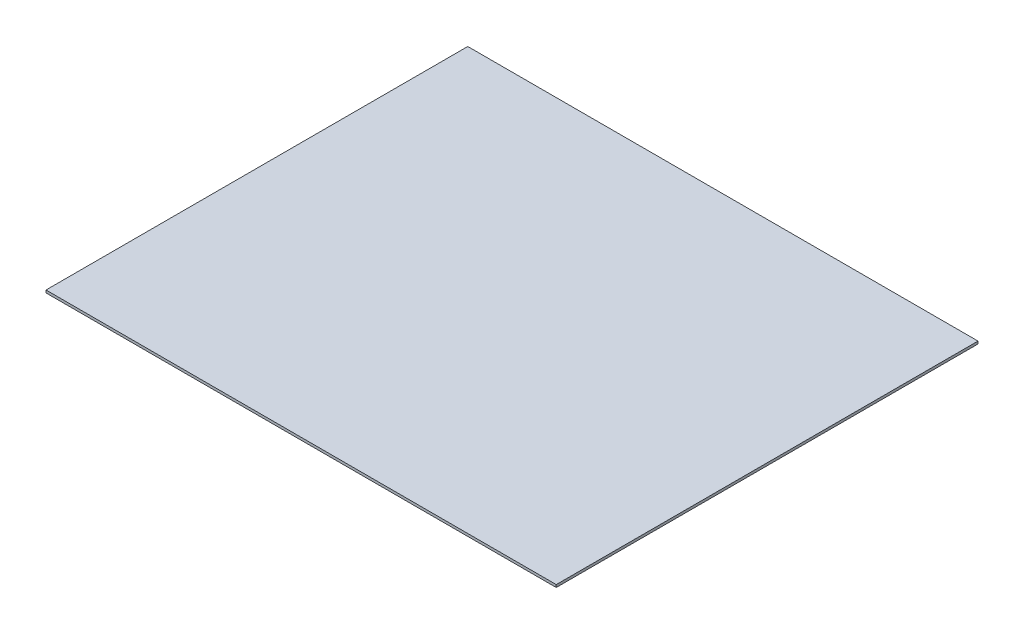
ISO-10303-21;
HEADER;
FILE_DESCRIPTION(('STEP AP214'),'2;1');
FILE_NAME('part.step','',(''),(''),'','','');
FILE_SCHEMA(('AUTOMOTIVE_DESIGN { 1 0 10303 214 1 1 1 1 }'));
ENDSEC;
DATA;
#1=APPLICATION_CONTEXT('core data for automotive mechanical design processes');
#2=APPLICATION_PROTOCOL_DEFINITION('international standard','automotive_design',2000,#1);
#3=PRODUCT_CONTEXT('',#1,'mechanical');
#4=PRODUCT('Part','Part','',(#3));
#5=PRODUCT_RELATED_PRODUCT_CATEGORY('part','',(#4));
#6=PRODUCT_DEFINITION_FORMATION('','',#4);
#7=PRODUCT_DEFINITION_CONTEXT('part definition',#1,'design');
#8=PRODUCT_DEFINITION('design','',#6,#7);
#9=PRODUCT_DEFINITION_SHAPE('','',#8);
#10=(LENGTH_UNIT() NAMED_UNIT(*) SI_UNIT(.MILLI.,.METRE.));
#11=(NAMED_UNIT(*) PLANE_ANGLE_UNIT() SI_UNIT($,.RADIAN.));
#12=(NAMED_UNIT(*) SI_UNIT($,.STERADIAN.) SOLID_ANGLE_UNIT());
#13=UNCERTAINTY_MEASURE_WITH_UNIT(LENGTH_MEASURE(1.E-05),#10,'distance_accuracy_value','');
#14=(GEOMETRIC_REPRESENTATION_CONTEXT(3) GLOBAL_UNCERTAINTY_ASSIGNED_CONTEXT((#13)) GLOBAL_UNIT_ASSIGNED_CONTEXT((#10,
#11,#12)) REPRESENTATION_CONTEXT('',''));
#15=CARTESIAN_POINT('',(0.,0.,0.));
#16=DIRECTION('',(0.,0.,1.));
#17=DIRECTION('',(1.,0.,0.));
#18=AXIS2_PLACEMENT_3D('',#15,#16,#17);
#19=CARTESIAN_POINT('',(-278.480074335144,3.175,-264.439855000801));
#20=DIRECTION('',(1.,0.,0.));
#21=DIRECTION('',(0.,0.,-1.));
#22=AXIS2_PLACEMENT_3D('',#19,#20,#21);
#23=PLANE('',#22);
#24=DIRECTION('',(0.,0.,1.));
#25=VECTOR('',#24,1.);
#26=CARTESIAN_POINT('',(-278.480074335144,0.,-264.439855000801));
#27=LINE('',#26,#25);
#28=CARTESIAN_POINT('',(-278.480074335144,0.,-264.439855000801));
#29=VERTEX_POINT('',#28);
#30=CARTESIAN_POINT('',(-278.480074335144,0.,260.143804999309));
#31=VERTEX_POINT('',#30);
#32=EDGE_CURVE('E99',#29,#31,#27,.T.);
#33=ORIENTED_EDGE('',*,*,#32,.T.);
#34=DIRECTION('',(0.,-1.,0.));
#35=VECTOR('',#34,1.);
#36=CARTESIAN_POINT('',(-278.480074335144,3.175,260.143804999309));
#37=LINE('',#36,#35);
#38=CARTESIAN_POINT('',(-278.480074335144,3.175,260.143804999309));
#39=VERTEX_POINT('',#38);
#40=EDGE_CURVE('E11',#39,#31,#37,.T.);
#41=ORIENTED_EDGE('',*,*,#40,.F.);
#42=DIRECTION('',(0.,0.,1.));
#43=VECTOR('',#42,1.);
#44=CARTESIAN_POINT('',(-278.480074335144,3.175,-264.439855000801));
#45=LINE('',#44,#43);
#46=CARTESIAN_POINT('',(-278.480074335144,3.175,-264.439855000801));
#47=VERTEX_POINT('',#46);
#48=EDGE_CURVE('E87',#47,#39,#45,.T.);
#49=ORIENTED_EDGE('',*,*,#48,.F.);
#50=DIRECTION('',(0.,-1.,0.));
#51=VECTOR('',#50,1.);
#52=CARTESIAN_POINT('',(-278.480074335144,3.175,-264.439855000801));
#53=LINE('',#52,#51);
#54=EDGE_CURVE('E95',#47,#29,#53,.T.);
#55=ORIENTED_EDGE('',*,*,#54,.T.);
#56=EDGE_LOOP('',(#33,#41,#49,#55));
#57=FACE_BOUND('',#56,.T.);
#58=ADVANCED_FACE('F36',(#57),#23,.F.);
#59=CARTESIAN_POINT('',(-278.480074335144,3.175,260.143804999309));
#60=DIRECTION('',(0.,0.,-1.));
#61=DIRECTION('',(-1.,0.,0.));
#62=AXIS2_PLACEMENT_3D('',#59,#60,#61);
#63=PLANE('',#62);
#64=DIRECTION('',(1.,0.,0.));
#65=VECTOR('',#64,1.);
#66=CARTESIAN_POINT('',(-278.480074335144,0.,260.143804999309));
#67=LINE('',#66,#65);
#68=CARTESIAN_POINT('',(356.152658362128,0.,260.143804999309));
#69=VERTEX_POINT('',#68);
#70=EDGE_CURVE('E91',#31,#69,#67,.T.);
#71=ORIENTED_EDGE('',*,*,#70,.T.);
#72=DIRECTION('',(0.,-1.,0.));
#73=VECTOR('',#72,1.);
#74=CARTESIAN_POINT('',(356.152658362128,3.175,260.143804999309));
#75=LINE('',#74,#73);
#76=CARTESIAN_POINT('',(356.152658362128,3.175,260.143804999309));
#77=VERTEX_POINT('',#76);
#78=EDGE_CURVE('E44',#77,#69,#75,.T.);
#79=ORIENTED_EDGE('',*,*,#78,.F.);
#80=DIRECTION('',(1.,0.,0.));
#81=VECTOR('',#80,1.);
#82=CARTESIAN_POINT('',(-278.480074335144,3.175,260.143804999309));
#83=LINE('',#82,#81);
#84=EDGE_CURVE('E82',#39,#77,#83,.T.);
#85=ORIENTED_EDGE('',*,*,#84,.F.);
#86=ORIENTED_EDGE('',*,*,#40,.T.);
#87=EDGE_LOOP('',(#71,#79,#85,#86));
#88=FACE_BOUND('',#87,.T.);
#89=ADVANCED_FACE('F90',(#88),#63,.F.);
#90=CARTESIAN_POINT('',(356.152658362128,3.175,-264.439855000801));
#91=DIRECTION('',(-1.,0.,0.));
#92=DIRECTION('',(0.,0.,1.));
#93=AXIS2_PLACEMENT_3D('',#90,#91,#92);
#94=PLANE('',#93);
#95=DIRECTION('',(0.,0.,-1.));
#96=VECTOR('',#95,1.);
#97=CARTESIAN_POINT('',(356.152658362128,0.,-264.439855000801));
#98=LINE('',#97,#96);
#99=CARTESIAN_POINT('',(356.152658362128,0.,-264.439855000801));
#100=VERTEX_POINT('',#99);
#101=EDGE_CURVE('E69',#69,#100,#98,.T.);
#102=ORIENTED_EDGE('',*,*,#101,.T.);
#103=DIRECTION('',(0.,-1.,0.));
#104=VECTOR('',#103,1.);
#105=CARTESIAN_POINT('',(356.152658362128,3.175,-264.439855000801));
#106=LINE('',#105,#104);
#107=CARTESIAN_POINT('',(356.152658362128,3.175,-264.439855000801));
#108=VERTEX_POINT('',#107);
#109=EDGE_CURVE('E92',#108,#100,#106,.T.);
#110=ORIENTED_EDGE('',*,*,#109,.F.);
#111=DIRECTION('',(0.,0.,-1.));
#112=VECTOR('',#111,1.);
#113=CARTESIAN_POINT('',(356.152658362128,3.175,-264.439855000801));
#114=LINE('',#113,#112);
#115=EDGE_CURVE('E85',#77,#108,#114,.T.);
#116=ORIENTED_EDGE('',*,*,#115,.F.);
#117=ORIENTED_EDGE('',*,*,#78,.T.);
#118=EDGE_LOOP('',(#102,#110,#116,#117));
#119=FACE_BOUND('',#118,.T.);
#120=ADVANCED_FACE('F93',(#119),#94,.F.);
#121=CARTESIAN_POINT('',(-278.480074335144,3.175,-264.439855000801));
#122=DIRECTION('',(0.,0.,1.));
#123=DIRECTION('',(1.,0.,0.));
#124=AXIS2_PLACEMENT_3D('',#121,#122,#123);
#125=PLANE('',#124);
#126=DIRECTION('',(-1.,0.,0.));
#127=VECTOR('',#126,1.);
#128=CARTESIAN_POINT('',(-278.480074335144,0.,-264.439855000801));
#129=LINE('',#128,#127);
#130=EDGE_CURVE('E75',#100,#29,#129,.T.);
#131=ORIENTED_EDGE('',*,*,#130,.T.);
#132=ORIENTED_EDGE('',*,*,#54,.F.);
#133=DIRECTION('',(-1.,0.,0.));
#134=VECTOR('',#133,1.);
#135=CARTESIAN_POINT('',(-278.480074335144,3.175,-264.439855000801));
#136=LINE('',#135,#134);
#137=EDGE_CURVE('E52',#108,#47,#136,.T.);
#138=ORIENTED_EDGE('',*,*,#137,.F.);
#139=ORIENTED_EDGE('',*,*,#109,.T.);
#140=EDGE_LOOP('',(#131,#132,#138,#139));
#141=FACE_BOUND('',#140,.T.);
#142=ADVANCED_FACE('F106',(#141),#125,.F.);
#143=CARTESIAN_POINT('',(0.,3.175,0.));
#144=DIRECTION('',(0.,1.,0.));
#145=DIRECTION('',(0.,0.,1.));
#146=AXIS2_PLACEMENT_3D('',#143,#144,#145);
#147=PLANE('',#146);
#148=ORIENTED_EDGE('',*,*,#48,.T.);
#149=ORIENTED_EDGE('',*,*,#84,.T.);
#150=ORIENTED_EDGE('',*,*,#115,.T.);
#151=ORIENTED_EDGE('',*,*,#137,.T.);
#152=EDGE_LOOP('',(#148,#149,#150,#151));
#153=FACE_BOUND('',#152,.T.);
#154=ADVANCED_FACE('F83',(#153),#147,.T.);
#155=CARTESIAN_POINT('',(0.,0.,0.));
#156=DIRECTION('',(0.,1.,0.));
#157=DIRECTION('',(0.,0.,1.));
#158=AXIS2_PLACEMENT_3D('',#155,#156,#157);
#159=PLANE('',#158);
#160=ORIENTED_EDGE('',*,*,#32,.F.);
#161=ORIENTED_EDGE('',*,*,#130,.F.);
#162=ORIENTED_EDGE('',*,*,#101,.F.);
#163=ORIENTED_EDGE('',*,*,#70,.F.);
#164=EDGE_LOOP('',(#160,#161,#162,#163));
#165=FACE_BOUND('',#164,.T.);
#166=ADVANCED_FACE('F109',(#165),#159,.F.);
#167=CLOSED_SHELL('',(#58,#89,#120,#142,#154,#166));
#168=MANIFOLD_SOLID_BREP('B2',#167);
#169=ADVANCED_BREP_SHAPE_REPRESENTATION('',(#18,#168),#14);
#170=SHAPE_DEFINITION_REPRESENTATION(#9,#169);
ENDSEC;
END-ISO-10303-21;
